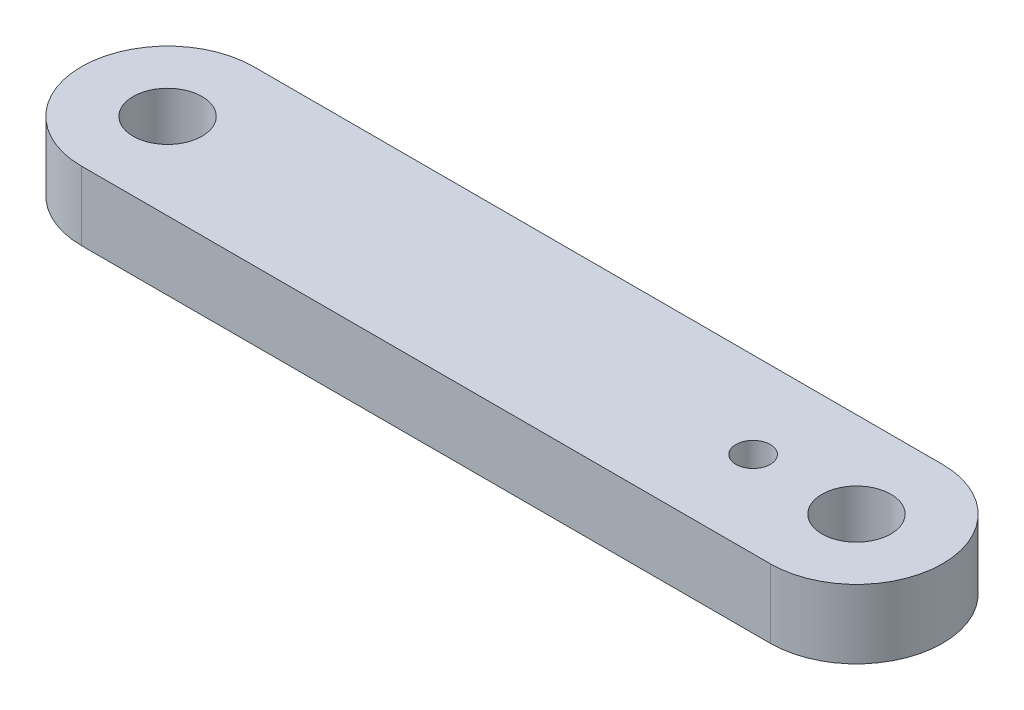
ISO-10303-21;
HEADER;
FILE_DESCRIPTION(('STEP AP214'),'2;1');
FILE_NAME('part.step','',(''),(''),'','','');
FILE_SCHEMA(('AUTOMOTIVE_DESIGN { 1 0 10303 214 1 1 1 1 }'));
ENDSEC;
DATA;
#1=APPLICATION_CONTEXT('core data for automotive mechanical design processes');
#2=APPLICATION_PROTOCOL_DEFINITION('international standard','automotive_design',2000,#1);
#3=PRODUCT_CONTEXT('',#1,'mechanical');
#4=PRODUCT('Part','Part','',(#3));
#5=PRODUCT_RELATED_PRODUCT_CATEGORY('part','',(#4));
#6=PRODUCT_DEFINITION_FORMATION('','',#4);
#7=PRODUCT_DEFINITION_CONTEXT('part definition',#1,'design');
#8=PRODUCT_DEFINITION('design','',#6,#7);
#9=PRODUCT_DEFINITION_SHAPE('','',#8);
#10=(LENGTH_UNIT() NAMED_UNIT(*) SI_UNIT(.MILLI.,.METRE.));
#11=(NAMED_UNIT(*) PLANE_ANGLE_UNIT() SI_UNIT($,.RADIAN.));
#12=(NAMED_UNIT(*) SI_UNIT($,.STERADIAN.) SOLID_ANGLE_UNIT());
#13=UNCERTAINTY_MEASURE_WITH_UNIT(LENGTH_MEASURE(1.E-05),#10,'distance_accuracy_value','');
#14=(GEOMETRIC_REPRESENTATION_CONTEXT(3) GLOBAL_UNCERTAINTY_ASSIGNED_CONTEXT((#13)) GLOBAL_UNIT_ASSIGNED_CONTEXT((#10,
#11,#12)) REPRESENTATION_CONTEXT('',''));
#15=CARTESIAN_POINT('',(0.,0.,0.));
#16=DIRECTION('',(0.,0.,1.));
#17=DIRECTION('',(1.,0.,0.));
#18=AXIS2_PLACEMENT_3D('',#15,#16,#17);
#19=CARTESIAN_POINT('',(-10.,2.,0.));
#20=DIRECTION('',(0.,1.,0.));
#21=DIRECTION('',(0.,0.,1.));
#22=AXIS2_PLACEMENT_3D('',#19,#20,#21);
#23=PLANE('',#22);
#24=CARTESIAN_POINT('',(7.,2.,0.));
#25=DIRECTION('',(0.,1.,0.));
#26=DIRECTION('',(0.,0.,1.));
#27=AXIS2_PLACEMENT_3D('',#24,#25,#26);
#28=CIRCLE('',#27,0.500000000000001);
#29=CARTESIAN_POINT('',(7.,2.,0.500000000000001));
#30=VERTEX_POINT('',#29);
#31=EDGE_CURVE('E129',#30,#30,#28,.T.);
#32=ORIENTED_EDGE('',*,*,#31,.F.);
#33=EDGE_LOOP('',(#32));
#34=FACE_BOUND('',#33,.T.);
#35=CARTESIAN_POINT('',(10.,2.,0.));
#36=DIRECTION('',(0.,1.,0.));
#37=DIRECTION('',(0.,0.,1.));
#38=AXIS2_PLACEMENT_3D('',#35,#36,#37);
#39=CIRCLE('',#38,1.);
#40=CARTESIAN_POINT('',(10.,2.,1.));
#41=VERTEX_POINT('',#40);
#42=EDGE_CURVE('E106',#41,#41,#39,.T.);
#43=ORIENTED_EDGE('',*,*,#42,.F.);
#44=EDGE_LOOP('',(#43));
#45=FACE_BOUND('',#44,.T.);
#46=CARTESIAN_POINT('',(-10.,2.,0.));
#47=DIRECTION('',(0.,1.,0.));
#48=DIRECTION('',(0.,0.,1.));
#49=AXIS2_PLACEMENT_3D('',#46,#47,#48);
#50=CIRCLE('',#49,2.5);
#51=CARTESIAN_POINT('',(-10.,2.,-2.5));
#52=VERTEX_POINT('',#51);
#53=CARTESIAN_POINT('',(-10.,2.,2.5));
#54=VERTEX_POINT('',#53);
#55=EDGE_CURVE('E90',#52,#54,#50,.T.);
#56=ORIENTED_EDGE('',*,*,#55,.T.);
#57=DIRECTION('',(1.,0.,0.));
#58=VECTOR('',#57,1.);
#59=CARTESIAN_POINT('',(-10.,2.,2.5));
#60=LINE('',#59,#58);
#61=CARTESIAN_POINT('',(10.,2.,2.5));
#62=VERTEX_POINT('',#61);
#63=EDGE_CURVE('E85',#54,#62,#60,.T.);
#64=ORIENTED_EDGE('',*,*,#63,.T.);
#65=CARTESIAN_POINT('',(10.,2.,0.));
#66=DIRECTION('',(0.,1.,0.));
#67=DIRECTION('',(0.,0.,1.));
#68=AXIS2_PLACEMENT_3D('',#65,#66,#67);
#69=CIRCLE('',#68,2.5);
#70=CARTESIAN_POINT('',(10.,2.,-2.5));
#71=VERTEX_POINT('',#70);
#72=EDGE_CURVE('E88',#62,#71,#69,.T.);
#73=ORIENTED_EDGE('',*,*,#72,.T.);
#74=DIRECTION('',(-1.,0.,0.));
#75=VECTOR('',#74,1.);
#76=CARTESIAN_POINT('',(-10.,2.,-2.5));
#77=LINE('',#76,#75);
#78=EDGE_CURVE('E55',#71,#52,#77,.T.);
#79=ORIENTED_EDGE('',*,*,#78,.T.);
#80=EDGE_LOOP('',(#56,#64,#73,#79));
#81=FACE_BOUND('',#80,.T.);
#82=CARTESIAN_POINT('',(-10.,2.,0.));
#83=DIRECTION('',(0.,1.,0.));
#84=DIRECTION('',(0.,0.,1.));
#85=AXIS2_PLACEMENT_3D('',#82,#83,#84);
#86=CIRCLE('',#85,1.);
#87=CARTESIAN_POINT('',(-10.,2.,1.));
#88=VERTEX_POINT('',#87);
#89=EDGE_CURVE('E121',#88,#88,#86,.T.);
#90=ORIENTED_EDGE('',*,*,#89,.F.);
#91=EDGE_LOOP('',(#90));
#92=FACE_BOUND('',#91,.T.);
#93=ADVANCED_FACE('F37',(#34,#45,#81,#92),#23,.T.);
#94=CARTESIAN_POINT('',(-10.,0.,0.));
#95=DIRECTION('',(0.,1.,0.));
#96=DIRECTION('',(0.,0.,1.));
#97=AXIS2_PLACEMENT_3D('',#94,#95,#96);
#98=PLANE('',#97);
#99=CARTESIAN_POINT('',(7.,0.,0.));
#100=DIRECTION('',(0.,1.,0.));
#101=DIRECTION('',(0.,0.,1.));
#102=AXIS2_PLACEMENT_3D('',#99,#100,#101);
#103=CIRCLE('',#102,0.500000000000001);
#104=CARTESIAN_POINT('',(7.,0.,0.500000000000001));
#105=VERTEX_POINT('',#104);
#106=EDGE_CURVE('E41',#105,#105,#103,.T.);
#107=ORIENTED_EDGE('',*,*,#106,.T.);
#108=EDGE_LOOP('',(#107));
#109=FACE_BOUND('',#108,.T.);
#110=CARTESIAN_POINT('',(-10.,0.,0.));
#111=DIRECTION('',(0.,1.,0.));
#112=DIRECTION('',(0.,0.,1.));
#113=AXIS2_PLACEMENT_3D('',#110,#111,#112);
#114=CIRCLE('',#113,2.5);
#115=CARTESIAN_POINT('',(-10.,0.,-2.5));
#116=VERTEX_POINT('',#115);
#117=CARTESIAN_POINT('',(-10.,0.,2.5));
#118=VERTEX_POINT('',#117);
#119=EDGE_CURVE('E103',#116,#118,#114,.T.);
#120=ORIENTED_EDGE('',*,*,#119,.F.);
#121=DIRECTION('',(-1.,0.,0.));
#122=VECTOR('',#121,1.);
#123=CARTESIAN_POINT('',(-10.,0.,-2.5));
#124=LINE('',#123,#122);
#125=CARTESIAN_POINT('',(10.,0.,-2.5));
#126=VERTEX_POINT('',#125);
#127=EDGE_CURVE('E78',#126,#116,#124,.T.);
#128=ORIENTED_EDGE('',*,*,#127,.F.);
#129=CARTESIAN_POINT('',(10.,0.,0.));
#130=DIRECTION('',(0.,1.,0.));
#131=DIRECTION('',(0.,0.,1.));
#132=AXIS2_PLACEMENT_3D('',#129,#130,#131);
#133=CIRCLE('',#132,2.5);
#134=CARTESIAN_POINT('',(10.,0.,2.5));
#135=VERTEX_POINT('',#134);
#136=EDGE_CURVE('E72',#135,#126,#133,.T.);
#137=ORIENTED_EDGE('',*,*,#136,.F.);
#138=DIRECTION('',(1.,0.,0.));
#139=VECTOR('',#138,1.);
#140=CARTESIAN_POINT('',(-10.,0.,2.5));
#141=LINE('',#140,#139);
#142=EDGE_CURVE('E94',#118,#135,#141,.T.);
#143=ORIENTED_EDGE('',*,*,#142,.F.);
#144=EDGE_LOOP('',(#120,#128,#137,#143));
#145=FACE_BOUND('',#144,.T.);
#146=CARTESIAN_POINT('',(10.,0.,0.));
#147=DIRECTION('',(0.,1.,0.));
#148=DIRECTION('',(0.,0.,1.));
#149=AXIS2_PLACEMENT_3D('',#146,#147,#148);
#150=CIRCLE('',#149,1.);
#151=CARTESIAN_POINT('',(10.,0.,1.));
#152=VERTEX_POINT('',#151);
#153=EDGE_CURVE('E118',#152,#152,#150,.T.);
#154=ORIENTED_EDGE('',*,*,#153,.T.);
#155=EDGE_LOOP('',(#154));
#156=FACE_BOUND('',#155,.T.);
#157=CARTESIAN_POINT('',(-10.,0.,0.));
#158=DIRECTION('',(0.,1.,0.));
#159=DIRECTION('',(0.,0.,1.));
#160=AXIS2_PLACEMENT_3D('',#157,#158,#159);
#161=CIRCLE('',#160,1.);
#162=CARTESIAN_POINT('',(-10.,0.,1.));
#163=VERTEX_POINT('',#162);
#164=EDGE_CURVE('E124',#163,#163,#161,.T.);
#165=ORIENTED_EDGE('',*,*,#164,.T.);
#166=EDGE_LOOP('',(#165));
#167=FACE_BOUND('',#166,.T.);
#168=ADVANCED_FACE('F114',(#109,#145,#156,#167),#98,.F.);
#169=CARTESIAN_POINT('',(-10.,2.,0.));
#170=DIRECTION('',(0.,-1.,0.));
#171=DIRECTION('',(0.,0.,-1.));
#172=AXIS2_PLACEMENT_3D('',#169,#170,#171);
#173=CYLINDRICAL_SURFACE('',#172,2.5);
#174=ORIENTED_EDGE('',*,*,#119,.T.);
#175=DIRECTION('',(0.,-1.,0.));
#176=VECTOR('',#175,1.);
#177=CARTESIAN_POINT('',(-10.,2.,2.5));
#178=LINE('',#177,#176);
#179=EDGE_CURVE('E11',#54,#118,#178,.T.);
#180=ORIENTED_EDGE('',*,*,#179,.F.);
#181=ORIENTED_EDGE('',*,*,#55,.F.);
#182=DIRECTION('',(0.,-1.,0.));
#183=VECTOR('',#182,1.);
#184=CARTESIAN_POINT('',(-10.,2.,-2.5));
#185=LINE('',#184,#183);
#186=EDGE_CURVE('E99',#52,#116,#185,.T.);
#187=ORIENTED_EDGE('',*,*,#186,.T.);
#188=EDGE_LOOP('',(#174,#180,#181,#187));
#189=FACE_BOUND('',#188,.T.);
#190=ADVANCED_FACE('F39',(#189),#173,.T.);
#191=CARTESIAN_POINT('',(-10.,2.,2.5));
#192=DIRECTION('',(0.,0.,-1.));
#193=DIRECTION('',(-1.,0.,0.));
#194=AXIS2_PLACEMENT_3D('',#191,#192,#193);
#195=PLANE('',#194);
#196=ORIENTED_EDGE('',*,*,#142,.T.);
#197=DIRECTION('',(0.,-1.,0.));
#198=VECTOR('',#197,1.);
#199=CARTESIAN_POINT('',(10.,2.,2.5));
#200=LINE('',#199,#198);
#201=EDGE_CURVE('E47',#62,#135,#200,.T.);
#202=ORIENTED_EDGE('',*,*,#201,.F.);
#203=ORIENTED_EDGE('',*,*,#63,.F.);
#204=ORIENTED_EDGE('',*,*,#179,.T.);
#205=EDGE_LOOP('',(#196,#202,#203,#204));
#206=FACE_BOUND('',#205,.T.);
#207=ADVANCED_FACE('F93',(#206),#195,.F.);
#208=CARTESIAN_POINT('',(10.,2.,0.));
#209=DIRECTION('',(0.,-1.,0.));
#210=DIRECTION('',(0.,0.,-1.));
#211=AXIS2_PLACEMENT_3D('',#208,#209,#210);
#212=CYLINDRICAL_SURFACE('',#211,2.5);
#213=ORIENTED_EDGE('',*,*,#136,.T.);
#214=DIRECTION('',(0.,-1.,0.));
#215=VECTOR('',#214,1.);
#216=CARTESIAN_POINT('',(10.,2.,-2.5));
#217=LINE('',#216,#215);
#218=EDGE_CURVE('E95',#71,#126,#217,.T.);
#219=ORIENTED_EDGE('',*,*,#218,.F.);
#220=ORIENTED_EDGE('',*,*,#72,.F.);
#221=ORIENTED_EDGE('',*,*,#201,.T.);
#222=EDGE_LOOP('',(#213,#219,#220,#221));
#223=FACE_BOUND('',#222,.T.);
#224=ADVANCED_FACE('F97',(#223),#212,.T.);
#225=CARTESIAN_POINT('',(-10.,2.,-2.5));
#226=DIRECTION('',(0.,0.,1.));
#227=DIRECTION('',(1.,0.,0.));
#228=AXIS2_PLACEMENT_3D('',#225,#226,#227);
#229=PLANE('',#228);
#230=ORIENTED_EDGE('',*,*,#127,.T.);
#231=ORIENTED_EDGE('',*,*,#186,.F.);
#232=ORIENTED_EDGE('',*,*,#78,.F.);
#233=ORIENTED_EDGE('',*,*,#218,.T.);
#234=EDGE_LOOP('',(#230,#231,#232,#233));
#235=FACE_BOUND('',#234,.T.);
#236=ADVANCED_FACE('F111',(#235),#229,.F.);
#237=CARTESIAN_POINT('',(10.,2.,0.));
#238=DIRECTION('',(0.,-1.,0.));
#239=DIRECTION('',(0.,0.,-1.));
#240=AXIS2_PLACEMENT_3D('',#237,#238,#239);
#241=CYLINDRICAL_SURFACE('',#240,1.);
#242=ORIENTED_EDGE('',*,*,#42,.T.);
#243=EDGE_LOOP('',(#242));
#244=FACE_BOUND('',#243,.T.);
#245=ORIENTED_EDGE('',*,*,#153,.F.);
#246=EDGE_LOOP('',(#245));
#247=FACE_BOUND('',#246,.T.);
#248=ADVANCED_FACE('F144',(#244,#247),#241,.F.);
#249=CARTESIAN_POINT('',(-10.,2.,0.));
#250=DIRECTION('',(0.,-1.,0.));
#251=DIRECTION('',(0.,0.,-1.));
#252=AXIS2_PLACEMENT_3D('',#249,#250,#251);
#253=CYLINDRICAL_SURFACE('',#252,1.);
#254=ORIENTED_EDGE('',*,*,#89,.T.);
#255=EDGE_LOOP('',(#254));
#256=FACE_BOUND('',#255,.T.);
#257=ORIENTED_EDGE('',*,*,#164,.F.);
#258=EDGE_LOOP('',(#257));
#259=FACE_BOUND('',#258,.T.);
#260=ADVANCED_FACE('F139',(#256,#259),#253,.F.);
#261=CARTESIAN_POINT('',(7.,-8.,0.));
#262=DIRECTION('',(0.,1.,0.));
#263=DIRECTION('',(0.,0.,1.));
#264=AXIS2_PLACEMENT_3D('',#261,#262,#263);
#265=CYLINDRICAL_SURFACE('',#264,0.500000000000001);
#266=ORIENTED_EDGE('',*,*,#31,.T.);
#267=EDGE_LOOP('',(#266));
#268=FACE_BOUND('',#267,.T.);
#269=ORIENTED_EDGE('',*,*,#106,.F.);
#270=EDGE_LOOP('',(#269));
#271=FACE_BOUND('',#270,.T.);
#272=ADVANCED_FACE('F137',(#268,#271),#265,.F.);
#273=CLOSED_SHELL('',(#93,#168,#190,#207,#224,#236,#248,#260,#272));
#274=MANIFOLD_SOLID_BREP('B2',#273);
#275=ADVANCED_BREP_SHAPE_REPRESENTATION('',(#18,#274),#14);
#276=SHAPE_DEFINITION_REPRESENTATION(#9,#275);
ENDSEC;
END-ISO-10303-21;
